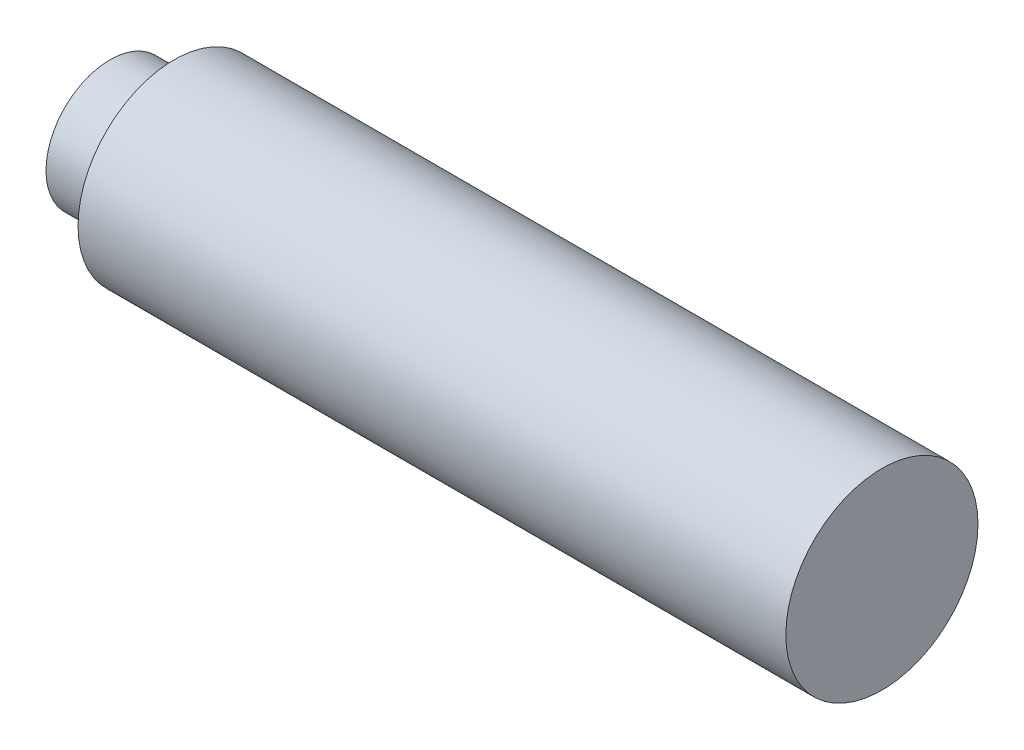
ISO-10303-21;
HEADER;
FILE_DESCRIPTION(('STEP AP214'),'2;1');
FILE_NAME('part.step','',(''),(''),'','','');
FILE_SCHEMA(('AUTOMOTIVE_DESIGN { 1 0 10303 214 1 1 1 1 }'));
ENDSEC;
DATA;
#1=APPLICATION_CONTEXT('core data for automotive mechanical design processes');
#2=APPLICATION_PROTOCOL_DEFINITION('international standard','automotive_design',2000,#1);
#3=PRODUCT_CONTEXT('',#1,'mechanical');
#4=PRODUCT('Part','Part','',(#3));
#5=PRODUCT_RELATED_PRODUCT_CATEGORY('part','',(#4));
#6=PRODUCT_DEFINITION_FORMATION('','',#4);
#7=PRODUCT_DEFINITION_CONTEXT('part definition',#1,'design');
#8=PRODUCT_DEFINITION('design','',#6,#7);
#9=PRODUCT_DEFINITION_SHAPE('','',#8);
#10=(LENGTH_UNIT() NAMED_UNIT(*) SI_UNIT(.MILLI.,.METRE.));
#11=(NAMED_UNIT(*) PLANE_ANGLE_UNIT() SI_UNIT($,.RADIAN.));
#12=(NAMED_UNIT(*) SI_UNIT($,.STERADIAN.) SOLID_ANGLE_UNIT());
#13=UNCERTAINTY_MEASURE_WITH_UNIT(LENGTH_MEASURE(1.E-05),#10,'distance_accuracy_value','');
#14=(GEOMETRIC_REPRESENTATION_CONTEXT(3) GLOBAL_UNCERTAINTY_ASSIGNED_CONTEXT((#13)) GLOBAL_UNIT_ASSIGNED_CONTEXT((#10,
#11,#12)) REPRESENTATION_CONTEXT('',''));
#15=CARTESIAN_POINT('',(0.,0.,0.));
#16=DIRECTION('',(0.,0.,1.));
#17=DIRECTION('',(1.,0.,0.));
#18=AXIS2_PLACEMENT_3D('',#15,#16,#17);
#19=CARTESIAN_POINT('',(-25.125,5.,0.));
#20=DIRECTION('',(1.,0.,0.));
#21=DIRECTION('',(0.,0.,-1.));
#22=AXIS2_PLACEMENT_3D('',#19,#20,#21);
#23=PLANE('',#22);
#24=CARTESIAN_POINT('',(-25.125,0.,0.));
#25=DIRECTION('',(-1.,0.,0.));
#26=DIRECTION('',(0.,0.,1.));
#27=AXIS2_PLACEMENT_3D('',#24,#25,#26);
#28=CIRCLE('',#27,5.);
#29=CARTESIAN_POINT('',(-25.125,0.,5.));
#30=VERTEX_POINT('',#29);
#31=EDGE_CURVE('E53',#30,#30,#28,.T.);
#32=ORIENTED_EDGE('',*,*,#31,.F.);
#33=EDGE_LOOP('',(#32));
#34=FACE_BOUND('',#33,.T.);
#35=CARTESIAN_POINT('',(-25.125,0.,0.));
#36=DIRECTION('',(-1.,0.,0.));
#37=DIRECTION('',(0.,0.,1.));
#38=AXIS2_PLACEMENT_3D('',#35,#36,#37);
#39=CIRCLE('',#38,7.5);
#40=CARTESIAN_POINT('',(-25.125,0.,7.5));
#41=VERTEX_POINT('',#40);
#42=EDGE_CURVE('E10',#41,#41,#39,.T.);
#43=ORIENTED_EDGE('',*,*,#42,.T.);
#44=EDGE_LOOP('',(#43));
#45=FACE_BOUND('',#44,.T.);
#46=ADVANCED_FACE('F31',(#34,#45),#23,.F.);
#47=CARTESIAN_POINT('',(0.,0.,0.));
#48=DIRECTION('',(-1.,0.,0.));
#49=DIRECTION('',(0.,0.,1.));
#50=AXIS2_PLACEMENT_3D('',#47,#48,#49);
#51=CYLINDRICAL_SURFACE('',#50,7.5);
#52=ORIENTED_EDGE('',*,*,#42,.F.);
#53=EDGE_LOOP('',(#52));
#54=FACE_BOUND('',#53,.T.);
#55=CARTESIAN_POINT('',(30.125,0.,0.));
#56=DIRECTION('',(-1.,0.,0.));
#57=DIRECTION('',(0.,0.,1.));
#58=AXIS2_PLACEMENT_3D('',#55,#56,#57);
#59=CIRCLE('',#58,7.5);
#60=CARTESIAN_POINT('',(30.125,0.,7.5));
#61=VERTEX_POINT('',#60);
#62=EDGE_CURVE('E37',#61,#61,#59,.T.);
#63=ORIENTED_EDGE('',*,*,#62,.T.);
#64=EDGE_LOOP('',(#63));
#65=FACE_BOUND('',#64,.T.);
#66=ADVANCED_FACE('F60',(#54,#65),#51,.T.);
#67=CARTESIAN_POINT('',(30.125,7.5,0.));
#68=DIRECTION('',(-1.,0.,0.));
#69=DIRECTION('',(0.,0.,1.));
#70=AXIS2_PLACEMENT_3D('',#67,#68,#69);
#71=PLANE('',#70);
#72=ORIENTED_EDGE('',*,*,#62,.F.);
#73=EDGE_LOOP('',(#72));
#74=FACE_BOUND('',#73,.T.);
#75=ADVANCED_FACE('F64',(#74),#71,.F.);
#76=CARTESIAN_POINT('',(-15.245,0.,0.));
#77=DIRECTION('',(1.,0.,0.));
#78=DIRECTION('',(0.,0.,-1.));
#79=AXIS2_PLACEMENT_3D('',#76,#77,#78);
#80=PLANE('',#79);
#81=CARTESIAN_POINT('',(-15.245,0.,0.));
#82=DIRECTION('',(-1.,0.,0.));
#83=DIRECTION('',(0.,0.,1.));
#84=AXIS2_PLACEMENT_3D('',#81,#82,#83);
#85=CIRCLE('',#84,2.5);
#86=CARTESIAN_POINT('',(-15.245,0.,2.5));
#87=VERTEX_POINT('',#86);
#88=EDGE_CURVE('E41',#87,#87,#85,.T.);
#89=ORIENTED_EDGE('',*,*,#88,.T.);
#90=EDGE_LOOP('',(#89));
#91=FACE_BOUND('',#90,.T.);
#92=ADVANCED_FACE('F69',(#91),#80,.F.);
#93=CARTESIAN_POINT('',(0.,0.,0.));
#94=DIRECTION('',(-1.,0.,0.));
#95=DIRECTION('',(0.,0.,1.));
#96=AXIS2_PLACEMENT_3D('',#93,#94,#95);
#97=CYLINDRICAL_SURFACE('',#96,2.5);
#98=ORIENTED_EDGE('',*,*,#88,.F.);
#99=EDGE_LOOP('',(#98));
#100=FACE_BOUND('',#99,.T.);
#101=CARTESIAN_POINT('',(-30.125,0.,0.));
#102=DIRECTION('',(-1.,0.,0.));
#103=DIRECTION('',(0.,0.,1.));
#104=AXIS2_PLACEMENT_3D('',#101,#102,#103);
#105=CIRCLE('',#104,2.5);
#106=CARTESIAN_POINT('',(-30.125,0.,2.5));
#107=VERTEX_POINT('',#106);
#108=EDGE_CURVE('E45',#107,#107,#105,.T.);
#109=ORIENTED_EDGE('',*,*,#108,.T.);
#110=EDGE_LOOP('',(#109));
#111=FACE_BOUND('',#110,.T.);
#112=ADVANCED_FACE('F75',(#100,#111),#97,.F.);
#113=CARTESIAN_POINT('',(-30.125,2.5,0.));
#114=DIRECTION('',(1.,0.,0.));
#115=DIRECTION('',(0.,0.,-1.));
#116=AXIS2_PLACEMENT_3D('',#113,#114,#115);
#117=PLANE('',#116);
#118=ORIENTED_EDGE('',*,*,#108,.F.);
#119=EDGE_LOOP('',(#118));
#120=FACE_BOUND('',#119,.T.);
#121=CARTESIAN_POINT('',(-30.125,0.,0.));
#122=DIRECTION('',(-1.,0.,0.));
#123=DIRECTION('',(0.,0.,1.));
#124=AXIS2_PLACEMENT_3D('',#121,#122,#123);
#125=CIRCLE('',#124,5.);
#126=CARTESIAN_POINT('',(-30.125,0.,5.));
#127=VERTEX_POINT('',#126);
#128=EDGE_CURVE('E50',#127,#127,#125,.T.);
#129=ORIENTED_EDGE('',*,*,#128,.T.);
#130=EDGE_LOOP('',(#129));
#131=FACE_BOUND('',#130,.T.);
#132=ADVANCED_FACE('F79',(#120,#131),#117,.F.);
#133=CARTESIAN_POINT('',(0.,0.,0.));
#134=DIRECTION('',(-1.,0.,0.));
#135=DIRECTION('',(0.,0.,1.));
#136=AXIS2_PLACEMENT_3D('',#133,#134,#135);
#137=CYLINDRICAL_SURFACE('',#136,5.);
#138=ORIENTED_EDGE('',*,*,#128,.F.);
#139=EDGE_LOOP('',(#138));
#140=FACE_BOUND('',#139,.T.);
#141=ORIENTED_EDGE('',*,*,#31,.T.);
#142=EDGE_LOOP('',(#141));
#143=FACE_BOUND('',#142,.T.);
#144=ADVANCED_FACE('F57',(#140,#143),#137,.T.);
#145=CLOSED_SHELL('',(#46,#66,#75,#92,#112,#132,#144));
#146=MANIFOLD_SOLID_BREP('B2',#145);
#147=ADVANCED_BREP_SHAPE_REPRESENTATION('',(#18,#146),#14);
#148=SHAPE_DEFINITION_REPRESENTATION(#9,#147);
ENDSEC;
END-ISO-10303-21;
